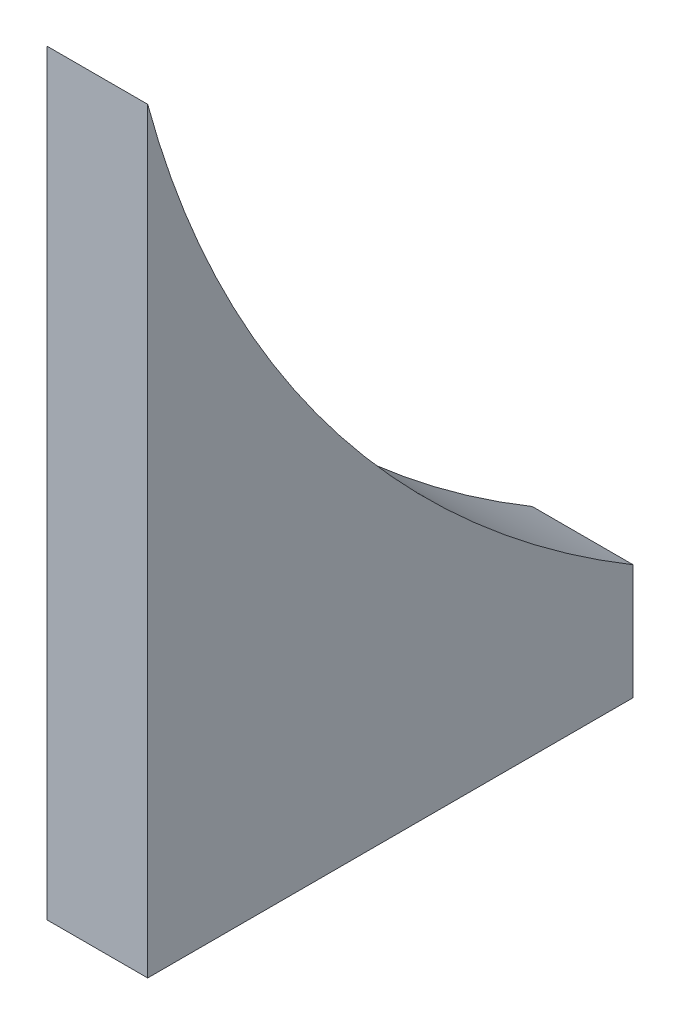
ISO-10303-21;
HEADER;
FILE_DESCRIPTION(('STEP AP214'),'2;1');
FILE_NAME('part.step','',(''),(''),'','','');
FILE_SCHEMA(('AUTOMOTIVE_DESIGN { 1 0 10303 214 1 1 1 1 }'));
ENDSEC;
DATA;
#1=APPLICATION_CONTEXT('core data for automotive mechanical design processes');
#2=APPLICATION_PROTOCOL_DEFINITION('international standard','automotive_design',2000,#1);
#3=PRODUCT_CONTEXT('',#1,'mechanical');
#4=PRODUCT('Part','Part','',(#3));
#5=PRODUCT_RELATED_PRODUCT_CATEGORY('part','',(#4));
#6=PRODUCT_DEFINITION_FORMATION('','',#4);
#7=PRODUCT_DEFINITION_CONTEXT('part definition',#1,'design');
#8=PRODUCT_DEFINITION('design','',#6,#7);
#9=PRODUCT_DEFINITION_SHAPE('','',#8);
#10=(LENGTH_UNIT() NAMED_UNIT(*) SI_UNIT(.MILLI.,.METRE.));
#11=(NAMED_UNIT(*) PLANE_ANGLE_UNIT() SI_UNIT($,.RADIAN.));
#12=(NAMED_UNIT(*) SI_UNIT($,.STERADIAN.) SOLID_ANGLE_UNIT());
#13=UNCERTAINTY_MEASURE_WITH_UNIT(LENGTH_MEASURE(1.E-05),#10,'distance_accuracy_value','');
#14=(GEOMETRIC_REPRESENTATION_CONTEXT(3) GLOBAL_UNCERTAINTY_ASSIGNED_CONTEXT((#13)) GLOBAL_UNIT_ASSIGNED_CONTEXT((#10,
#11,#12)) REPRESENTATION_CONTEXT('',''));
#15=CARTESIAN_POINT('',(0.,0.,0.));
#16=DIRECTION('',(0.,0.,1.));
#17=DIRECTION('',(1.,0.,0.));
#18=AXIS2_PLACEMENT_3D('',#15,#16,#17);
#19=CARTESIAN_POINT('',(4.,33.4342691998875,-29.2351488879258));
#20=DIRECTION('',(-1.,0.,0.));
#21=DIRECTION('',(0.,0.,1.));
#22=AXIS2_PLACEMENT_3D('',#19,#20,#21);
#23=CYLINDRICAL_SURFACE('',#22,42.5753320593088);
#24=CARTESIAN_POINT('',(4.,33.4342691998875,-29.2351488879258));
#25=DIRECTION('',(-1.,0.,0.));
#26=DIRECTION('',(0.,0.,-1.));
#27=AXIS2_PLACEMENT_3D('',#24,#25,#26);
#28=CIRCLE('',#27,42.5753320593088);
#29=CARTESIAN_POINT('',(4.,-3.10524913020123,-7.38286067443378));
#30=VERTEX_POINT('',#29);
#31=CARTESIAN_POINT('',(4.,22.3319809863954,11.8671393255662));
#32=VERTEX_POINT('',#31);
#33=EDGE_CURVE('E85',#30,#32,#28,.T.);
#34=ORIENTED_EDGE('',*,*,#33,.F.);
#35=DIRECTION('',(-1.,0.,0.));
#36=VECTOR('',#35,1.);
#37=CARTESIAN_POINT('',(4.,-3.10524913020123,-7.38286067443378));
#38=LINE('',#37,#36);
#39=CARTESIAN_POINT('',(0.,-3.10524913020123,-7.38286067443378));
#40=VERTEX_POINT('',#39);
#41=EDGE_CURVE('E90',#30,#40,#38,.T.);
#42=ORIENTED_EDGE('',*,*,#41,.T.);
#43=CARTESIAN_POINT('',(0.,33.4342691998875,-29.2351488879258));
#44=DIRECTION('',(-1.,0.,0.));
#45=DIRECTION('',(0.,0.,-1.));
#46=AXIS2_PLACEMENT_3D('',#43,#44,#45);
#47=CIRCLE('',#46,42.5753320593088);
#48=CARTESIAN_POINT('',(0.,22.3319809863954,11.8671393255662));
#49=VERTEX_POINT('',#48);
#50=EDGE_CURVE('E77',#40,#49,#47,.T.);
#51=ORIENTED_EDGE('',*,*,#50,.T.);
#52=DIRECTION('',(-1.,0.,0.));
#53=VECTOR('',#52,1.);
#54=CARTESIAN_POINT('',(4.,22.3319809863954,11.8671393255662));
#55=LINE('',#54,#53);
#56=EDGE_CURVE('E39',#32,#49,#55,.T.);
#57=ORIENTED_EDGE('',*,*,#56,.F.);
#58=EDGE_LOOP('',(#34,#42,#51,#57));
#59=FACE_BOUND('',#58,.T.);
#60=ADVANCED_FACE('F32',(#59),#23,.F.);
#61=CARTESIAN_POINT('',(4.,22.3319809863954,11.8671393255662));
#62=DIRECTION('',(0.,0.,-1.));
#63=DIRECTION('',(-1.,0.,0.));
#64=AXIS2_PLACEMENT_3D('',#61,#62,#63);
#65=PLANE('',#64);
#66=DIRECTION('',(0.,-1.,0.));
#67=VECTOR('',#66,1.);
#68=CARTESIAN_POINT('',(0.,22.3319809863954,11.8671393255662));
#69=LINE('',#68,#67);
#70=CARTESIAN_POINT('',(0.,-7.66801901360456,11.8671393255662));
#71=VERTEX_POINT('',#70);
#72=EDGE_CURVE('E67',#49,#71,#69,.T.);
#73=ORIENTED_EDGE('',*,*,#72,.T.);
#74=DIRECTION('',(-1.,0.,0.));
#75=VECTOR('',#74,1.);
#76=CARTESIAN_POINT('',(4.,-7.66801901360456,11.8671393255662));
#77=LINE('',#76,#75);
#78=CARTESIAN_POINT('',(4.,-7.66801901360456,11.8671393255662));
#79=VERTEX_POINT('',#78);
#80=EDGE_CURVE('E70',#79,#71,#77,.T.);
#81=ORIENTED_EDGE('',*,*,#80,.F.);
#82=DIRECTION('',(0.,-1.,0.));
#83=VECTOR('',#82,1.);
#84=CARTESIAN_POINT('',(4.,22.3319809863954,11.8671393255662));
#85=LINE('',#84,#83);
#86=EDGE_CURVE('E54',#32,#79,#85,.T.);
#87=ORIENTED_EDGE('',*,*,#86,.F.);
#88=ORIENTED_EDGE('',*,*,#56,.T.);
#89=EDGE_LOOP('',(#73,#81,#87,#88));
#90=FACE_BOUND('',#89,.T.);
#91=ADVANCED_FACE('F69',(#90),#65,.F.);
#92=CARTESIAN_POINT('',(4.,-7.66801901360456,11.8671393255662));
#93=DIRECTION('',(0.,1.,0.));
#94=DIRECTION('',(0.,0.,1.));
#95=AXIS2_PLACEMENT_3D('',#92,#93,#94);
#96=PLANE('',#95);
#97=DIRECTION('',(0.,0.,-1.));
#98=VECTOR('',#97,1.);
#99=CARTESIAN_POINT('',(0.,-7.66801901360456,11.8671393255662));
#100=LINE('',#99,#98);
#101=CARTESIAN_POINT('',(0.,-7.66801901360456,-7.38286067443378));
#102=VERTEX_POINT('',#101);
#103=EDGE_CURVE('E76',#71,#102,#100,.T.);
#104=ORIENTED_EDGE('',*,*,#103,.T.);
#105=DIRECTION('',(1.,0.,0.));
#106=VECTOR('',#105,1.);
#107=CARTESIAN_POINT('',(0.,-7.66801901360457,-7.38286067443378));
#108=LINE('',#107,#106);
#109=CARTESIAN_POINT('',(4.,-7.66801901360457,-7.38286067443378));
#110=VERTEX_POINT('',#109);
#111=EDGE_CURVE('E46',#102,#110,#108,.T.);
#112=ORIENTED_EDGE('',*,*,#111,.T.);
#113=DIRECTION('',(0.,0.,-1.));
#114=VECTOR('',#113,1.);
#115=CARTESIAN_POINT('',(4.,-7.66801901360456,11.8671393255662));
#116=LINE('',#115,#114);
#117=EDGE_CURVE('E82',#79,#110,#116,.T.);
#118=ORIENTED_EDGE('',*,*,#117,.F.);
#119=ORIENTED_EDGE('',*,*,#80,.T.);
#120=EDGE_LOOP('',(#104,#112,#118,#119));
#121=FACE_BOUND('',#120,.T.);
#122=ADVANCED_FACE('F81',(#121),#96,.F.);
#123=CARTESIAN_POINT('',(4.,33.4342691998875,-29.2351488879258));
#124=DIRECTION('',(1.,0.,0.));
#125=DIRECTION('',(0.,0.,-1.));
#126=AXIS2_PLACEMENT_3D('',#123,#124,#125);
#127=PLANE('',#126);
#128=DIRECTION('',(0.,-1.,0.));
#129=VECTOR('',#128,1.);
#130=CARTESIAN_POINT('',(4.,-7.66801901360457,-7.38286067443378));
#131=LINE('',#130,#129);
#132=EDGE_CURVE('E96',#30,#110,#131,.T.);
#133=ORIENTED_EDGE('',*,*,#132,.F.);
#134=ORIENTED_EDGE('',*,*,#33,.T.);
#135=ORIENTED_EDGE('',*,*,#86,.T.);
#136=ORIENTED_EDGE('',*,*,#117,.T.);
#137=EDGE_LOOP('',(#133,#134,#135,#136));
#138=FACE_BOUND('',#137,.T.);
#139=ADVANCED_FACE('F104',(#138),#127,.T.);
#140=CARTESIAN_POINT('',(0.,33.4342691998875,-29.2351488879258));
#141=DIRECTION('',(1.,0.,0.));
#142=DIRECTION('',(0.,0.,-1.));
#143=AXIS2_PLACEMENT_3D('',#140,#141,#142);
#144=PLANE('',#143);
#145=ORIENTED_EDGE('',*,*,#50,.F.);
#146=DIRECTION('',(0.,-1.,0.));
#147=VECTOR('',#146,1.);
#148=CARTESIAN_POINT('',(0.,33.4342691998875,-7.38286067443378));
#149=LINE('',#148,#147);
#150=EDGE_CURVE('E11',#40,#102,#149,.T.);
#151=ORIENTED_EDGE('',*,*,#150,.T.);
#152=ORIENTED_EDGE('',*,*,#103,.F.);
#153=ORIENTED_EDGE('',*,*,#72,.F.);
#154=EDGE_LOOP('',(#145,#151,#152,#153));
#155=FACE_BOUND('',#154,.T.);
#156=ADVANCED_FACE('F84',(#155),#144,.F.);
#157=CARTESIAN_POINT('',(0.,-7.66801901360457,-7.38286067443378));
#158=DIRECTION('',(0.,0.,1.));
#159=DIRECTION('',(1.,0.,0.));
#160=AXIS2_PLACEMENT_3D('',#157,#158,#159);
#161=PLANE('',#160);
#162=ORIENTED_EDGE('',*,*,#132,.T.);
#163=ORIENTED_EDGE('',*,*,#111,.F.);
#164=ORIENTED_EDGE('',*,*,#150,.F.);
#165=ORIENTED_EDGE('',*,*,#41,.F.);
#166=EDGE_LOOP('',(#162,#163,#164,#165));
#167=FACE_BOUND('',#166,.T.);
#168=ADVANCED_FACE('F100',(#167),#161,.F.);
#169=CLOSED_SHELL('',(#60,#91,#122,#139,#156,#168));
#170=MANIFOLD_SOLID_BREP('B2',#169);
#171=ADVANCED_BREP_SHAPE_REPRESENTATION('',(#18,#170),#14);
#172=SHAPE_DEFINITION_REPRESENTATION(#9,#171);
ENDSEC;
END-ISO-10303-21;
